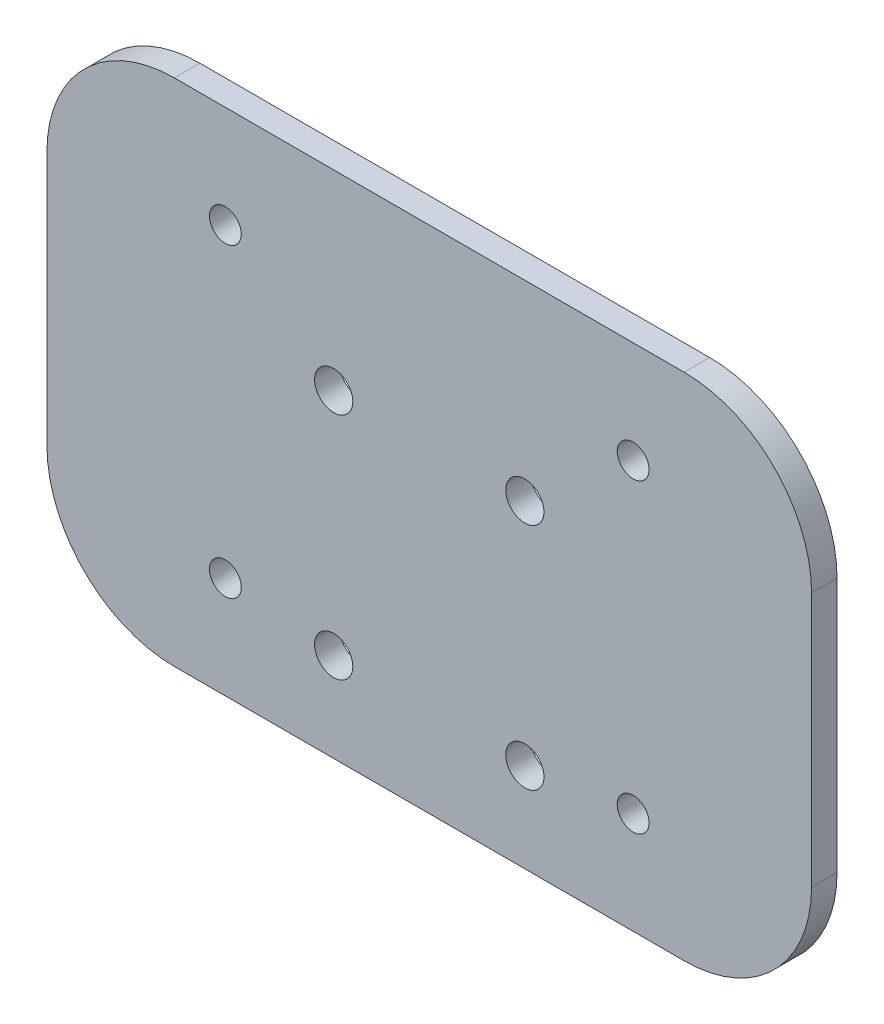
ISO-10303-21;
HEADER;
FILE_DESCRIPTION(('STEP AP214'),'2;1');
FILE_NAME('part.step','',(''),(''),'','','');
FILE_SCHEMA(('AUTOMOTIVE_DESIGN { 1 0 10303 214 1 1 1 1 }'));
ENDSEC;
DATA;
#1=APPLICATION_CONTEXT('core data for automotive mechanical design processes');
#2=APPLICATION_PROTOCOL_DEFINITION('international standard','automotive_design',2000,#1);
#3=PRODUCT_CONTEXT('',#1,'mechanical');
#4=PRODUCT('Part','Part','',(#3));
#5=PRODUCT_RELATED_PRODUCT_CATEGORY('part','',(#4));
#6=PRODUCT_DEFINITION_FORMATION('','',#4);
#7=PRODUCT_DEFINITION_CONTEXT('part definition',#1,'design');
#8=PRODUCT_DEFINITION('design','',#6,#7);
#9=PRODUCT_DEFINITION_SHAPE('','',#8);
#10=(LENGTH_UNIT() NAMED_UNIT(*) SI_UNIT(.MILLI.,.METRE.));
#11=(NAMED_UNIT(*) PLANE_ANGLE_UNIT() SI_UNIT($,.RADIAN.));
#12=(NAMED_UNIT(*) SI_UNIT($,.STERADIAN.) SOLID_ANGLE_UNIT());
#13=UNCERTAINTY_MEASURE_WITH_UNIT(LENGTH_MEASURE(1.E-05),#10,'distance_accuracy_value','');
#14=(GEOMETRIC_REPRESENTATION_CONTEXT(3) GLOBAL_UNCERTAINTY_ASSIGNED_CONTEXT((#13)) GLOBAL_UNIT_ASSIGNED_CONTEXT((#10,
#11,#12)) REPRESENTATION_CONTEXT('',''));
#15=CARTESIAN_POINT('',(0.,0.,0.));
#16=DIRECTION('',(0.,0.,1.));
#17=DIRECTION('',(1.,0.,0.));
#18=AXIS2_PLACEMENT_3D('',#15,#16,#17);
#19=CARTESIAN_POINT('',(0.,0.,2.));
#20=DIRECTION('',(0.,0.,-1.));
#21=DIRECTION('',(-1.,0.,0.));
#22=AXIS2_PLACEMENT_3D('',#19,#20,#21);
#23=PLANE('',#22);
#24=CARTESIAN_POINT('',(-7.5,-13.,2.));
#25=DIRECTION('',(0.,0.,1.));
#26=DIRECTION('',(1.,0.,0.));
#27=AXIS2_PLACEMENT_3D('',#24,#25,#26);
#28=CIRCLE('',#27,1.5);
#29=CARTESIAN_POINT('',(-6.,-13.,2.));
#30=VERTEX_POINT('',#29);
#31=EDGE_CURVE('E211',#30,#30,#28,.T.);
#32=ORIENTED_EDGE('',*,*,#31,.F.);
#33=EDGE_LOOP('',(#32));
#34=FACE_BOUND('',#33,.T.);
#35=CARTESIAN_POINT('',(7.5,-13.,2.));
#36=DIRECTION('',(0.,0.,1.));
#37=DIRECTION('',(1.,0.,0.));
#38=AXIS2_PLACEMENT_3D('',#35,#36,#37);
#39=CIRCLE('',#38,1.5);
#40=CARTESIAN_POINT('',(9.,-13.,2.));
#41=VERTEX_POINT('',#40);
#42=EDGE_CURVE('E217',#41,#41,#39,.T.);
#43=ORIENTED_EDGE('',*,*,#42,.F.);
#44=EDGE_LOOP('',(#43));
#45=FACE_BOUND('',#44,.T.);
#46=CARTESIAN_POINT('',(7.5,5.,2.));
#47=DIRECTION('',(0.,0.,1.));
#48=DIRECTION('',(1.,0.,0.));
#49=AXIS2_PLACEMENT_3D('',#46,#47,#48);
#50=CIRCLE('',#49,1.5);
#51=CARTESIAN_POINT('',(9.,5.,2.));
#52=VERTEX_POINT('',#51);
#53=EDGE_CURVE('E223',#52,#52,#50,.T.);
#54=ORIENTED_EDGE('',*,*,#53,.F.);
#55=EDGE_LOOP('',(#54));
#56=FACE_BOUND('',#55,.T.);
#57=CARTESIAN_POINT('',(-7.5,5.,2.));
#58=DIRECTION('',(0.,0.,1.));
#59=DIRECTION('',(1.,0.,0.));
#60=AXIS2_PLACEMENT_3D('',#57,#58,#59);
#61=CIRCLE('',#60,1.5);
#62=CARTESIAN_POINT('',(-6.,5.,2.));
#63=VERTEX_POINT('',#62);
#64=EDGE_CURVE('E205',#63,#63,#61,.T.);
#65=ORIENTED_EDGE('',*,*,#64,.F.);
#66=EDGE_LOOP('',(#65));
#67=FACE_BOUND('',#66,.T.);
#68=DIRECTION('',(-1.,0.,0.));
#69=VECTOR('',#68,1.);
#70=CARTESIAN_POINT('',(-30.,20.,2.));
#71=LINE('',#70,#69);
#72=CARTESIAN_POINT('',(20.,20.,2.));
#73=VERTEX_POINT('',#72);
#74=CARTESIAN_POINT('',(-20.,20.,2.));
#75=VERTEX_POINT('',#74);
#76=EDGE_CURVE('E171',#73,#75,#71,.T.);
#77=ORIENTED_EDGE('',*,*,#76,.T.);
#78=CARTESIAN_POINT('',(-20.,10.,2.));
#79=DIRECTION('',(0.,0.,-1.));
#80=DIRECTION('',(-1.,0.,0.));
#81=AXIS2_PLACEMENT_3D('',#78,#79,#80);
#82=CIRCLE('',#81,10.);
#83=CARTESIAN_POINT('',(-30.,10.,2.));
#84=VERTEX_POINT('',#83);
#85=EDGE_CURVE('E149',#75,#84,#82,.F.);
#86=ORIENTED_EDGE('',*,*,#85,.T.);
#87=DIRECTION('',(0.,-1.,0.));
#88=VECTOR('',#87,1.);
#89=CARTESIAN_POINT('',(-30.,-20.,2.));
#90=LINE('',#89,#88);
#91=CARTESIAN_POINT('',(-30.,-10.,2.));
#92=VERTEX_POINT('',#91);
#93=EDGE_CURVE('E119',#84,#92,#90,.T.);
#94=ORIENTED_EDGE('',*,*,#93,.T.);
#95=CARTESIAN_POINT('',(-20.,-10.,2.));
#96=DIRECTION('',(0.,0.,-1.));
#97=DIRECTION('',(-1.,0.,0.));
#98=AXIS2_PLACEMENT_3D('',#95,#96,#97);
#99=CIRCLE('',#98,10.);
#100=CARTESIAN_POINT('',(-20.,-20.,2.));
#101=VERTEX_POINT('',#100);
#102=EDGE_CURVE('E55',#92,#101,#99,.F.);
#103=ORIENTED_EDGE('',*,*,#102,.T.);
#104=DIRECTION('',(1.,0.,0.));
#105=VECTOR('',#104,1.);
#106=CARTESIAN_POINT('',(-30.,-20.,2.));
#107=LINE('',#106,#105);
#108=CARTESIAN_POINT('',(20.,-20.,2.));
#109=VERTEX_POINT('',#108);
#110=EDGE_CURVE('E135',#101,#109,#107,.T.);
#111=ORIENTED_EDGE('',*,*,#110,.T.);
#112=CARTESIAN_POINT('',(20.,-10.,2.));
#113=DIRECTION('',(0.,0.,-1.));
#114=DIRECTION('',(-1.,0.,0.));
#115=AXIS2_PLACEMENT_3D('',#112,#113,#114);
#116=CIRCLE('',#115,10.);
#117=CARTESIAN_POINT('',(30.,-10.,2.));
#118=VERTEX_POINT('',#117);
#119=EDGE_CURVE('E145',#109,#118,#116,.F.);
#120=ORIENTED_EDGE('',*,*,#119,.T.);
#121=DIRECTION('',(0.,1.,0.));
#122=VECTOR('',#121,1.);
#123=CARTESIAN_POINT('',(30.,-20.,2.));
#124=LINE('',#123,#122);
#125=CARTESIAN_POINT('',(30.,10.,2.));
#126=VERTEX_POINT('',#125);
#127=EDGE_CURVE('E129',#118,#126,#124,.T.);
#128=ORIENTED_EDGE('',*,*,#127,.T.);
#129=CARTESIAN_POINT('',(20.,10.,2.));
#130=DIRECTION('',(0.,0.,-1.));
#131=DIRECTION('',(-1.,0.,0.));
#132=AXIS2_PLACEMENT_3D('',#129,#130,#131);
#133=CIRCLE('',#132,10.);
#134=EDGE_CURVE('E147',#126,#73,#133,.F.);
#135=ORIENTED_EDGE('',*,*,#134,.T.);
#136=EDGE_LOOP('',(#77,#86,#94,#103,#111,#120,#128,#135));
#137=FACE_BOUND('',#136,.T.);
#138=CARTESIAN_POINT('',(-16.,12.,2.));
#139=DIRECTION('',(0.,0.,1.));
#140=DIRECTION('',(1.,0.,0.));
#141=AXIS2_PLACEMENT_3D('',#138,#139,#140);
#142=CIRCLE('',#141,1.25);
#143=CARTESIAN_POINT('',(-14.75,12.,2.));
#144=VERTEX_POINT('',#143);
#145=EDGE_CURVE('E180',#144,#144,#142,.T.);
#146=ORIENTED_EDGE('',*,*,#145,.F.);
#147=EDGE_LOOP('',(#146));
#148=FACE_BOUND('',#147,.T.);
#149=CARTESIAN_POINT('',(16.,12.,2.));
#150=DIRECTION('',(0.,0.,1.));
#151=DIRECTION('',(1.,0.,0.));
#152=AXIS2_PLACEMENT_3D('',#149,#150,#151);
#153=CIRCLE('',#152,1.25);
#154=CARTESIAN_POINT('',(17.25,12.,2.));
#155=VERTEX_POINT('',#154);
#156=EDGE_CURVE('E185',#155,#155,#153,.T.);
#157=ORIENTED_EDGE('',*,*,#156,.F.);
#158=EDGE_LOOP('',(#157));
#159=FACE_BOUND('',#158,.T.);
#160=CARTESIAN_POINT('',(16.,-12.,2.));
#161=DIRECTION('',(0.,0.,1.));
#162=DIRECTION('',(1.,0.,0.));
#163=AXIS2_PLACEMENT_3D('',#160,#161,#162);
#164=CIRCLE('',#163,1.25);
#165=CARTESIAN_POINT('',(17.25,-12.,2.));
#166=VERTEX_POINT('',#165);
#167=EDGE_CURVE('E190',#166,#166,#164,.T.);
#168=ORIENTED_EDGE('',*,*,#167,.F.);
#169=EDGE_LOOP('',(#168));
#170=FACE_BOUND('',#169,.T.);
#171=CARTESIAN_POINT('',(-16.,-12.,2.));
#172=DIRECTION('',(0.,0.,1.));
#173=DIRECTION('',(1.,0.,0.));
#174=AXIS2_PLACEMENT_3D('',#171,#172,#173);
#175=CIRCLE('',#174,1.25);
#176=CARTESIAN_POINT('',(-14.75,-12.,2.));
#177=VERTEX_POINT('',#176);
#178=EDGE_CURVE('E196',#177,#177,#175,.T.);
#179=ORIENTED_EDGE('',*,*,#178,.F.);
#180=EDGE_LOOP('',(#179));
#181=FACE_BOUND('',#180,.T.);
#182=ADVANCED_FACE('F35',(#34,#45,#56,#67,#137,#148,#159,#170,#181),#23,.F.);
#183=CARTESIAN_POINT('',(0.,0.,0.));
#184=DIRECTION('',(0.,0.,-1.));
#185=DIRECTION('',(-1.,0.,0.));
#186=AXIS2_PLACEMENT_3D('',#183,#184,#185);
#187=PLANE('',#186);
#188=CARTESIAN_POINT('',(-7.5,-13.,0.));
#189=DIRECTION('',(0.,0.,1.));
#190=DIRECTION('',(1.,0.,0.));
#191=AXIS2_PLACEMENT_3D('',#188,#189,#190);
#192=CIRCLE('',#191,1.5);
#193=CARTESIAN_POINT('',(-6.,-13.,0.));
#194=VERTEX_POINT('',#193);
#195=EDGE_CURVE('E214',#194,#194,#192,.T.);
#196=ORIENTED_EDGE('',*,*,#195,.T.);
#197=EDGE_LOOP('',(#196));
#198=FACE_BOUND('',#197,.T.);
#199=CARTESIAN_POINT('',(7.5,-13.,0.));
#200=DIRECTION('',(0.,0.,1.));
#201=DIRECTION('',(1.,0.,0.));
#202=AXIS2_PLACEMENT_3D('',#199,#200,#201);
#203=CIRCLE('',#202,1.5);
#204=CARTESIAN_POINT('',(9.,-13.,0.));
#205=VERTEX_POINT('',#204);
#206=EDGE_CURVE('E220',#205,#205,#203,.T.);
#207=ORIENTED_EDGE('',*,*,#206,.T.);
#208=EDGE_LOOP('',(#207));
#209=FACE_BOUND('',#208,.T.);
#210=CARTESIAN_POINT('',(7.5,5.,0.));
#211=DIRECTION('',(0.,0.,1.));
#212=DIRECTION('',(1.,0.,0.));
#213=AXIS2_PLACEMENT_3D('',#210,#211,#212);
#214=CIRCLE('',#213,1.5);
#215=CARTESIAN_POINT('',(9.,5.,0.));
#216=VERTEX_POINT('',#215);
#217=EDGE_CURVE('E208',#216,#216,#214,.T.);
#218=ORIENTED_EDGE('',*,*,#217,.T.);
#219=EDGE_LOOP('',(#218));
#220=FACE_BOUND('',#219,.T.);
#221=CARTESIAN_POINT('',(-7.5,5.,0.));
#222=DIRECTION('',(0.,0.,1.));
#223=DIRECTION('',(1.,0.,0.));
#224=AXIS2_PLACEMENT_3D('',#221,#222,#223);
#225=CIRCLE('',#224,1.5);
#226=CARTESIAN_POINT('',(-6.,5.,0.));
#227=VERTEX_POINT('',#226);
#228=EDGE_CURVE('E202',#227,#227,#225,.T.);
#229=ORIENTED_EDGE('',*,*,#228,.T.);
#230=EDGE_LOOP('',(#229));
#231=FACE_BOUND('',#230,.T.);
#232=CARTESIAN_POINT('',(16.,-12.,0.));
#233=DIRECTION('',(0.,0.,1.));
#234=DIRECTION('',(1.,0.,0.));
#235=AXIS2_PLACEMENT_3D('',#232,#233,#234);
#236=CIRCLE('',#235,1.25);
#237=CARTESIAN_POINT('',(17.25,-12.,0.));
#238=VERTEX_POINT('',#237);
#239=EDGE_CURVE('E193',#238,#238,#236,.T.);
#240=ORIENTED_EDGE('',*,*,#239,.T.);
#241=EDGE_LOOP('',(#240));
#242=FACE_BOUND('',#241,.T.);
#243=CARTESIAN_POINT('',(-16.,12.,0.));
#244=DIRECTION('',(0.,0.,1.));
#245=DIRECTION('',(1.,0.,0.));
#246=AXIS2_PLACEMENT_3D('',#243,#244,#245);
#247=CIRCLE('',#246,1.25);
#248=CARTESIAN_POINT('',(-14.75,12.,0.));
#249=VERTEX_POINT('',#248);
#250=EDGE_CURVE('E176',#249,#249,#247,.T.);
#251=ORIENTED_EDGE('',*,*,#250,.T.);
#252=EDGE_LOOP('',(#251));
#253=FACE_BOUND('',#252,.T.);
#254=DIRECTION('',(0.,-1.,0.));
#255=VECTOR('',#254,1.);
#256=CARTESIAN_POINT('',(-30.,-20.,0.));
#257=LINE('',#256,#255);
#258=CARTESIAN_POINT('',(-30.,10.,0.));
#259=VERTEX_POINT('',#258);
#260=CARTESIAN_POINT('',(-30.,-10.,0.));
#261=VERTEX_POINT('',#260);
#262=EDGE_CURVE('E117',#259,#261,#257,.T.);
#263=ORIENTED_EDGE('',*,*,#262,.F.);
#264=CARTESIAN_POINT('',(-20.,10.,0.));
#265=DIRECTION('',(0.,0.,-1.));
#266=DIRECTION('',(-1.,0.,0.));
#267=AXIS2_PLACEMENT_3D('',#264,#265,#266);
#268=CIRCLE('',#267,10.);
#269=CARTESIAN_POINT('',(-20.,20.,0.));
#270=VERTEX_POINT('',#269);
#271=EDGE_CURVE('E100',#259,#270,#268,.T.);
#272=ORIENTED_EDGE('',*,*,#271,.T.);
#273=DIRECTION('',(-1.,0.,0.));
#274=VECTOR('',#273,1.);
#275=CARTESIAN_POINT('',(-30.,20.,0.));
#276=LINE('',#275,#274);
#277=CARTESIAN_POINT('',(20.,20.,0.));
#278=VERTEX_POINT('',#277);
#279=EDGE_CURVE('E127',#278,#270,#276,.T.);
#280=ORIENTED_EDGE('',*,*,#279,.F.);
#281=CARTESIAN_POINT('',(20.,10.,0.));
#282=DIRECTION('',(0.,0.,-1.));
#283=DIRECTION('',(-1.,0.,0.));
#284=AXIS2_PLACEMENT_3D('',#281,#282,#283);
#285=CIRCLE('',#284,10.);
#286=CARTESIAN_POINT('',(30.,10.,0.));
#287=VERTEX_POINT('',#286);
#288=EDGE_CURVE('E111',#278,#287,#285,.T.);
#289=ORIENTED_EDGE('',*,*,#288,.T.);
#290=DIRECTION('',(0.,1.,0.));
#291=VECTOR('',#290,1.);
#292=CARTESIAN_POINT('',(30.,-20.,0.));
#293=LINE('',#292,#291);
#294=CARTESIAN_POINT('',(30.,-10.,0.));
#295=VERTEX_POINT('',#294);
#296=EDGE_CURVE('E131',#295,#287,#293,.T.);
#297=ORIENTED_EDGE('',*,*,#296,.F.);
#298=CARTESIAN_POINT('',(20.,-10.,0.));
#299=DIRECTION('',(0.,0.,-1.));
#300=DIRECTION('',(-1.,0.,0.));
#301=AXIS2_PLACEMENT_3D('',#298,#299,#300);
#302=CIRCLE('',#301,10.);
#303=CARTESIAN_POINT('',(20.,-20.,0.));
#304=VERTEX_POINT('',#303);
#305=EDGE_CURVE('E138',#295,#304,#302,.T.);
#306=ORIENTED_EDGE('',*,*,#305,.T.);
#307=DIRECTION('',(1.,0.,0.));
#308=VECTOR('',#307,1.);
#309=CARTESIAN_POINT('',(-30.,-20.,0.));
#310=LINE('',#309,#308);
#311=CARTESIAN_POINT('',(-20.,-20.,0.));
#312=VERTEX_POINT('',#311);
#313=EDGE_CURVE('E126',#312,#304,#310,.T.);
#314=ORIENTED_EDGE('',*,*,#313,.F.);
#315=CARTESIAN_POINT('',(-20.,-10.,0.));
#316=DIRECTION('',(0.,0.,-1.));
#317=DIRECTION('',(-1.,0.,0.));
#318=AXIS2_PLACEMENT_3D('',#315,#316,#317);
#319=CIRCLE('',#318,10.);
#320=EDGE_CURVE('E120',#312,#261,#319,.T.);
#321=ORIENTED_EDGE('',*,*,#320,.T.);
#322=EDGE_LOOP('',(#263,#272,#280,#289,#297,#306,#314,#321));
#323=FACE_BOUND('',#322,.T.);
#324=CARTESIAN_POINT('',(16.,12.,0.));
#325=DIRECTION('',(0.,0.,1.));
#326=DIRECTION('',(1.,0.,0.));
#327=AXIS2_PLACEMENT_3D('',#324,#325,#326);
#328=CIRCLE('',#327,1.25);
#329=CARTESIAN_POINT('',(17.25,12.,0.));
#330=VERTEX_POINT('',#329);
#331=EDGE_CURVE('E187',#330,#330,#328,.T.);
#332=ORIENTED_EDGE('',*,*,#331,.T.);
#333=EDGE_LOOP('',(#332));
#334=FACE_BOUND('',#333,.T.);
#335=CARTESIAN_POINT('',(-16.,-12.,0.));
#336=DIRECTION('',(0.,0.,1.));
#337=DIRECTION('',(1.,0.,0.));
#338=AXIS2_PLACEMENT_3D('',#335,#336,#337);
#339=CIRCLE('',#338,1.25);
#340=CARTESIAN_POINT('',(-14.75,-12.,0.));
#341=VERTEX_POINT('',#340);
#342=EDGE_CURVE('E199',#341,#341,#339,.T.);
#343=ORIENTED_EDGE('',*,*,#342,.T.);
#344=EDGE_LOOP('',(#343));
#345=FACE_BOUND('',#344,.T.);
#346=ADVANCED_FACE('F123',(#198,#209,#220,#231,#242,#253,#323,#334,#345),#187,.T.);
#347=CARTESIAN_POINT('',(30.,-20.,2.));
#348=DIRECTION('',(-1.,0.,0.));
#349=DIRECTION('',(0.,-1.,0.));
#350=AXIS2_PLACEMENT_3D('',#347,#348,#349);
#351=PLANE('',#350);
#352=ORIENTED_EDGE('',*,*,#296,.T.);
#353=DIRECTION('',(0.,0.,-1.));
#354=VECTOR('',#353,1.);
#355=CARTESIAN_POINT('',(30.,10.,2.));
#356=LINE('',#355,#354);
#357=EDGE_CURVE('E154',#287,#126,#356,.F.);
#358=ORIENTED_EDGE('',*,*,#357,.T.);
#359=ORIENTED_EDGE('',*,*,#127,.F.);
#360=DIRECTION('',(0.,0.,-1.));
#361=VECTOR('',#360,1.);
#362=CARTESIAN_POINT('',(30.,-10.,2.));
#363=LINE('',#362,#361);
#364=EDGE_CURVE('E151',#118,#295,#363,.T.);
#365=ORIENTED_EDGE('',*,*,#364,.T.);
#366=EDGE_LOOP('',(#352,#358,#359,#365));
#367=FACE_BOUND('',#366,.T.);
#368=ADVANCED_FACE('F167',(#367),#351,.F.);
#369=CARTESIAN_POINT('',(-30.,20.,2.));
#370=DIRECTION('',(0.,-1.,0.));
#371=DIRECTION('',(1.,0.,0.));
#372=AXIS2_PLACEMENT_3D('',#369,#370,#371);
#373=PLANE('',#372);
#374=ORIENTED_EDGE('',*,*,#279,.T.);
#375=DIRECTION('',(0.,0.,-1.));
#376=VECTOR('',#375,1.);
#377=CARTESIAN_POINT('',(-20.,20.,2.));
#378=LINE('',#377,#376);
#379=EDGE_CURVE('E105',#270,#75,#378,.F.);
#380=ORIENTED_EDGE('',*,*,#379,.T.);
#381=ORIENTED_EDGE('',*,*,#76,.F.);
#382=DIRECTION('',(0.,0.,-1.));
#383=VECTOR('',#382,1.);
#384=CARTESIAN_POINT('',(20.,20.,2.));
#385=LINE('',#384,#383);
#386=EDGE_CURVE('E110',#73,#278,#385,.T.);
#387=ORIENTED_EDGE('',*,*,#386,.T.);
#388=EDGE_LOOP('',(#374,#380,#381,#387));
#389=FACE_BOUND('',#388,.T.);
#390=ADVANCED_FACE('F266',(#389),#373,.F.);
#391=CARTESIAN_POINT('',(-30.,-20.,2.));
#392=DIRECTION('',(1.,0.,0.));
#393=DIRECTION('',(0.,0.,-1.));
#394=AXIS2_PLACEMENT_3D('',#391,#392,#393);
#395=PLANE('',#394);
#396=ORIENTED_EDGE('',*,*,#93,.F.);
#397=DIRECTION('',(0.,0.,-1.));
#398=VECTOR('',#397,1.);
#399=CARTESIAN_POINT('',(-30.,10.,2.));
#400=LINE('',#399,#398);
#401=EDGE_CURVE('E104',#84,#259,#400,.T.);
#402=ORIENTED_EDGE('',*,*,#401,.T.);
#403=ORIENTED_EDGE('',*,*,#262,.T.);
#404=DIRECTION('',(0.,0.,-1.));
#405=VECTOR('',#404,1.);
#406=CARTESIAN_POINT('',(-30.,-10.,2.));
#407=LINE('',#406,#405);
#408=EDGE_CURVE('E121',#261,#92,#407,.F.);
#409=ORIENTED_EDGE('',*,*,#408,.T.);
#410=EDGE_LOOP('',(#396,#402,#403,#409));
#411=FACE_BOUND('',#410,.T.);
#412=ADVANCED_FACE('F116',(#411),#395,.F.);
#413=CARTESIAN_POINT('',(-30.,-20.,2.));
#414=DIRECTION('',(0.,1.,0.));
#415=DIRECTION('',(-1.,0.,0.));
#416=AXIS2_PLACEMENT_3D('',#413,#414,#415);
#417=PLANE('',#416);
#418=ORIENTED_EDGE('',*,*,#313,.T.);
#419=DIRECTION('',(0.,0.,-1.));
#420=VECTOR('',#419,1.);
#421=CARTESIAN_POINT('',(20.,-20.,2.));
#422=LINE('',#421,#420);
#423=EDGE_CURVE('E11',#304,#109,#422,.F.);
#424=ORIENTED_EDGE('',*,*,#423,.T.);
#425=ORIENTED_EDGE('',*,*,#110,.F.);
#426=DIRECTION('',(0.,0.,-1.));
#427=VECTOR('',#426,1.);
#428=CARTESIAN_POINT('',(-20.,-20.,2.));
#429=LINE('',#428,#427);
#430=EDGE_CURVE('E43',#101,#312,#429,.T.);
#431=ORIENTED_EDGE('',*,*,#430,.T.);
#432=EDGE_LOOP('',(#418,#424,#425,#431));
#433=FACE_BOUND('',#432,.T.);
#434=ADVANCED_FACE('F157',(#433),#417,.F.);
#435=CARTESIAN_POINT('',(-16.,12.,2.));
#436=DIRECTION('',(0.,0.,-1.));
#437=DIRECTION('',(-1.,0.,0.));
#438=AXIS2_PLACEMENT_3D('',#435,#436,#437);
#439=CYLINDRICAL_SURFACE('',#438,1.25);
#440=ORIENTED_EDGE('',*,*,#145,.T.);
#441=EDGE_LOOP('',(#440));
#442=FACE_BOUND('',#441,.T.);
#443=ORIENTED_EDGE('',*,*,#250,.F.);
#444=EDGE_LOOP('',(#443));
#445=FACE_BOUND('',#444,.T.);
#446=ADVANCED_FACE('F273',(#442,#445),#439,.F.);
#447=CARTESIAN_POINT('',(16.,12.,2.));
#448=DIRECTION('',(0.,0.,-1.));
#449=DIRECTION('',(-1.,0.,0.));
#450=AXIS2_PLACEMENT_3D('',#447,#448,#449);
#451=CYLINDRICAL_SURFACE('',#450,1.25);
#452=ORIENTED_EDGE('',*,*,#156,.T.);
#453=EDGE_LOOP('',(#452));
#454=FACE_BOUND('',#453,.T.);
#455=ORIENTED_EDGE('',*,*,#331,.F.);
#456=EDGE_LOOP('',(#455));
#457=FACE_BOUND('',#456,.T.);
#458=ADVANCED_FACE('F303',(#454,#457),#451,.F.);
#459=CARTESIAN_POINT('',(16.,-12.,2.));
#460=DIRECTION('',(0.,0.,-1.));
#461=DIRECTION('',(-1.,0.,0.));
#462=AXIS2_PLACEMENT_3D('',#459,#460,#461);
#463=CYLINDRICAL_SURFACE('',#462,1.25);
#464=ORIENTED_EDGE('',*,*,#167,.T.);
#465=EDGE_LOOP('',(#464));
#466=FACE_BOUND('',#465,.T.);
#467=ORIENTED_EDGE('',*,*,#239,.F.);
#468=EDGE_LOOP('',(#467));
#469=FACE_BOUND('',#468,.T.);
#470=ADVANCED_FACE('F256',(#466,#469),#463,.F.);
#471=CARTESIAN_POINT('',(-16.,-12.,2.));
#472=DIRECTION('',(0.,0.,-1.));
#473=DIRECTION('',(-1.,0.,0.));
#474=AXIS2_PLACEMENT_3D('',#471,#472,#473);
#475=CYLINDRICAL_SURFACE('',#474,1.25);
#476=ORIENTED_EDGE('',*,*,#178,.T.);
#477=EDGE_LOOP('',(#476));
#478=FACE_BOUND('',#477,.T.);
#479=ORIENTED_EDGE('',*,*,#342,.F.);
#480=EDGE_LOOP('',(#479));
#481=FACE_BOUND('',#480,.T.);
#482=ADVANCED_FACE('F253',(#478,#481),#475,.F.);
#483=CARTESIAN_POINT('',(-20.,10.,2.));
#484=DIRECTION('',(0.,0.,-1.));
#485=DIRECTION('',(-1.,0.,0.));
#486=AXIS2_PLACEMENT_3D('',#483,#484,#485);
#487=CYLINDRICAL_SURFACE('',#486,10.);
#488=ORIENTED_EDGE('',*,*,#85,.F.);
#489=ORIENTED_EDGE('',*,*,#379,.F.);
#490=ORIENTED_EDGE('',*,*,#271,.F.);
#491=ORIENTED_EDGE('',*,*,#401,.F.);
#492=EDGE_LOOP('',(#488,#489,#490,#491));
#493=FACE_BOUND('',#492,.T.);
#494=ADVANCED_FACE('F103',(#493),#487,.T.);
#495=CARTESIAN_POINT('',(20.,10.,2.));
#496=DIRECTION('',(0.,0.,-1.));
#497=DIRECTION('',(-1.,0.,0.));
#498=AXIS2_PLACEMENT_3D('',#495,#496,#497);
#499=CYLINDRICAL_SURFACE('',#498,10.);
#500=ORIENTED_EDGE('',*,*,#134,.F.);
#501=ORIENTED_EDGE('',*,*,#357,.F.);
#502=ORIENTED_EDGE('',*,*,#288,.F.);
#503=ORIENTED_EDGE('',*,*,#386,.F.);
#504=EDGE_LOOP('',(#500,#501,#502,#503));
#505=FACE_BOUND('',#504,.T.);
#506=ADVANCED_FACE('F281',(#505),#499,.T.);
#507=CARTESIAN_POINT('',(20.,-10.,2.));
#508=DIRECTION('',(0.,0.,-1.));
#509=DIRECTION('',(-1.,0.,0.));
#510=AXIS2_PLACEMENT_3D('',#507,#508,#509);
#511=CYLINDRICAL_SURFACE('',#510,10.);
#512=ORIENTED_EDGE('',*,*,#119,.F.);
#513=ORIENTED_EDGE('',*,*,#423,.F.);
#514=ORIENTED_EDGE('',*,*,#305,.F.);
#515=ORIENTED_EDGE('',*,*,#364,.F.);
#516=EDGE_LOOP('',(#512,#513,#514,#515));
#517=FACE_BOUND('',#516,.T.);
#518=ADVANCED_FACE('F164',(#517),#511,.T.);
#519=CARTESIAN_POINT('',(-20.,-10.,2.));
#520=DIRECTION('',(0.,0.,-1.));
#521=DIRECTION('',(-1.,0.,0.));
#522=AXIS2_PLACEMENT_3D('',#519,#520,#521);
#523=CYLINDRICAL_SURFACE('',#522,10.);
#524=ORIENTED_EDGE('',*,*,#102,.F.);
#525=ORIENTED_EDGE('',*,*,#408,.F.);
#526=ORIENTED_EDGE('',*,*,#320,.F.);
#527=ORIENTED_EDGE('',*,*,#430,.F.);
#528=EDGE_LOOP('',(#524,#525,#526,#527));
#529=FACE_BOUND('',#528,.T.);
#530=ADVANCED_FACE('F37',(#529),#523,.T.);
#531=CARTESIAN_POINT('',(-7.5,5.,0.));
#532=DIRECTION('',(0.,0.,1.));
#533=DIRECTION('',(1.,0.,0.));
#534=AXIS2_PLACEMENT_3D('',#531,#532,#533);
#535=CYLINDRICAL_SURFACE('',#534,1.5);
#536=ORIENTED_EDGE('',*,*,#228,.F.);
#537=EDGE_LOOP('',(#536));
#538=FACE_BOUND('',#537,.T.);
#539=ORIENTED_EDGE('',*,*,#64,.T.);
#540=EDGE_LOOP('',(#539));
#541=FACE_BOUND('',#540,.T.);
#542=ADVANCED_FACE('F235',(#538,#541),#535,.F.);
#543=CARTESIAN_POINT('',(7.5,5.,0.));
#544=DIRECTION('',(0.,0.,1.));
#545=DIRECTION('',(1.,0.,0.));
#546=AXIS2_PLACEMENT_3D('',#543,#544,#545);
#547=CYLINDRICAL_SURFACE('',#546,1.5);
#548=ORIENTED_EDGE('',*,*,#217,.F.);
#549=EDGE_LOOP('',(#548));
#550=FACE_BOUND('',#549,.T.);
#551=ORIENTED_EDGE('',*,*,#53,.T.);
#552=EDGE_LOOP('',(#551));
#553=FACE_BOUND('',#552,.T.);
#554=ADVANCED_FACE('F231',(#550,#553),#547,.F.);
#555=CARTESIAN_POINT('',(7.5,-13.,0.));
#556=DIRECTION('',(0.,0.,1.));
#557=DIRECTION('',(1.,0.,0.));
#558=AXIS2_PLACEMENT_3D('',#555,#556,#557);
#559=CYLINDRICAL_SURFACE('',#558,1.5);
#560=ORIENTED_EDGE('',*,*,#206,.F.);
#561=EDGE_LOOP('',(#560));
#562=FACE_BOUND('',#561,.T.);
#563=ORIENTED_EDGE('',*,*,#42,.T.);
#564=EDGE_LOOP('',(#563));
#565=FACE_BOUND('',#564,.T.);
#566=ADVANCED_FACE('F234',(#562,#565),#559,.F.);
#567=CARTESIAN_POINT('',(-7.5,-13.,0.));
#568=DIRECTION('',(0.,0.,1.));
#569=DIRECTION('',(1.,0.,0.));
#570=AXIS2_PLACEMENT_3D('',#567,#568,#569);
#571=CYLINDRICAL_SURFACE('',#570,1.5);
#572=ORIENTED_EDGE('',*,*,#195,.F.);
#573=EDGE_LOOP('',(#572));
#574=FACE_BOUND('',#573,.T.);
#575=ORIENTED_EDGE('',*,*,#31,.T.);
#576=EDGE_LOOP('',(#575));
#577=FACE_BOUND('',#576,.T.);
#578=ADVANCED_FACE('F298',(#574,#577),#571,.F.);
#579=CLOSED_SHELL('',(#182,#346,#368,#390,#412,#434,#446,#458,#470,#482,#494,#506,#518,#530,
#542,#554,#566,#578));
#580=MANIFOLD_SOLID_BREP('B2',#579);
#581=ADVANCED_BREP_SHAPE_REPRESENTATION('',(#18,#580),#14);
#582=SHAPE_DEFINITION_REPRESENTATION(#9,#581);
ENDSEC;
END-ISO-10303-21;
